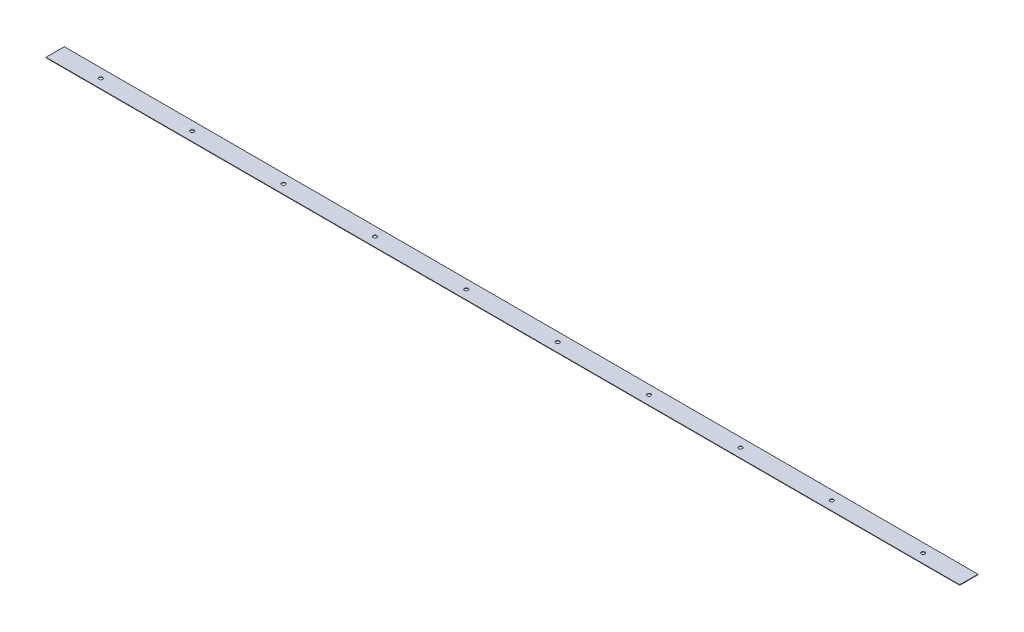
ISO-10303-21;
HEADER;
FILE_DESCRIPTION(('STEP AP214'),'2;1');
FILE_NAME('part.step','',(''),(''),'','','');
FILE_SCHEMA(('AUTOMOTIVE_DESIGN { 1 0 10303 214 1 1 1 1 }'));
ENDSEC;
DATA;
#1=APPLICATION_CONTEXT('core data for automotive mechanical design processes');
#2=APPLICATION_PROTOCOL_DEFINITION('international standard','automotive_design',2000,#1);
#3=PRODUCT_CONTEXT('',#1,'mechanical');
#4=PRODUCT('Part','Part','',(#3));
#5=PRODUCT_RELATED_PRODUCT_CATEGORY('part','',(#4));
#6=PRODUCT_DEFINITION_FORMATION('','',#4);
#7=PRODUCT_DEFINITION_CONTEXT('part definition',#1,'design');
#8=PRODUCT_DEFINITION('design','',#6,#7);
#9=PRODUCT_DEFINITION_SHAPE('','',#8);
#10=(LENGTH_UNIT() NAMED_UNIT(*) SI_UNIT(.MILLI.,.METRE.));
#11=(NAMED_UNIT(*) PLANE_ANGLE_UNIT() SI_UNIT($,.RADIAN.));
#12=(NAMED_UNIT(*) SI_UNIT($,.STERADIAN.) SOLID_ANGLE_UNIT());
#13=UNCERTAINTY_MEASURE_WITH_UNIT(LENGTH_MEASURE(1.E-05),#10,'distance_accuracy_value','');
#14=(GEOMETRIC_REPRESENTATION_CONTEXT(3) GLOBAL_UNCERTAINTY_ASSIGNED_CONTEXT((#13)) GLOBAL_UNIT_ASSIGNED_CONTEXT((#10,
#11,#12)) REPRESENTATION_CONTEXT('',''));
#15=CARTESIAN_POINT('',(0.,0.,0.));
#16=DIRECTION('',(0.,0.,1.));
#17=DIRECTION('',(1.,0.,0.));
#18=AXIS2_PLACEMENT_3D('',#15,#16,#17);
#19=CARTESIAN_POINT('',(500.,-0.5,10.));
#20=DIRECTION('',(1.,0.,0.));
#21=DIRECTION('',(0.,0.,-1.));
#22=AXIS2_PLACEMENT_3D('',#19,#20,#21);
#23=PLANE('',#22);
#24=DIRECTION('',(0.,0.,-1.));
#25=VECTOR('',#24,1.);
#26=CARTESIAN_POINT('',(500.,0.,10.));
#27=LINE('',#26,#25);
#28=CARTESIAN_POINT('',(500.,0.,10.));
#29=VERTEX_POINT('',#28);
#30=CARTESIAN_POINT('',(500.,0.,-10.));
#31=VERTEX_POINT('',#30);
#32=EDGE_CURVE('E103',#29,#31,#27,.T.);
#33=ORIENTED_EDGE('',*,*,#32,.F.);
#34=DIRECTION('',(0.,1.,0.));
#35=VECTOR('',#34,1.);
#36=CARTESIAN_POINT('',(500.,-0.5,10.));
#37=LINE('',#36,#35);
#38=CARTESIAN_POINT('',(500.,-0.5,10.));
#39=VERTEX_POINT('',#38);
#40=EDGE_CURVE('E11',#39,#29,#37,.T.);
#41=ORIENTED_EDGE('',*,*,#40,.F.);
#42=DIRECTION('',(0.,0.,-1.));
#43=VECTOR('',#42,1.);
#44=CARTESIAN_POINT('',(500.,-0.5,10.));
#45=LINE('',#44,#43);
#46=CARTESIAN_POINT('',(500.,-0.5,-10.));
#47=VERTEX_POINT('',#46);
#48=EDGE_CURVE('E96',#39,#47,#45,.T.);
#49=ORIENTED_EDGE('',*,*,#48,.T.);
#50=DIRECTION('',(0.,1.,0.));
#51=VECTOR('',#50,1.);
#52=CARTESIAN_POINT('',(500.,-0.5,-10.));
#53=LINE('',#52,#51);
#54=EDGE_CURVE('E41',#47,#31,#53,.T.);
#55=ORIENTED_EDGE('',*,*,#54,.T.);
#56=EDGE_LOOP('',(#33,#41,#49,#55));
#57=FACE_BOUND('',#56,.T.);
#58=ADVANCED_FACE('F38',(#57),#23,.T.);
#59=CARTESIAN_POINT('',(-500.,-0.5,10.));
#60=DIRECTION('',(0.,0.,1.));
#61=DIRECTION('',(1.,0.,0.));
#62=AXIS2_PLACEMENT_3D('',#59,#60,#61);
#63=PLANE('',#62);
#64=DIRECTION('',(1.,0.,0.));
#65=VECTOR('',#64,1.);
#66=CARTESIAN_POINT('',(-500.,0.,10.));
#67=LINE('',#66,#65);
#68=CARTESIAN_POINT('',(-500.,0.,10.));
#69=VERTEX_POINT('',#68);
#70=EDGE_CURVE('E98',#69,#29,#67,.T.);
#71=ORIENTED_EDGE('',*,*,#70,.F.);
#72=DIRECTION('',(0.,1.,0.));
#73=VECTOR('',#72,1.);
#74=CARTESIAN_POINT('',(-500.,-0.5,10.));
#75=LINE('',#74,#73);
#76=CARTESIAN_POINT('',(-500.,-0.5,10.));
#77=VERTEX_POINT('',#76);
#78=EDGE_CURVE('E47',#77,#69,#75,.T.);
#79=ORIENTED_EDGE('',*,*,#78,.F.);
#80=DIRECTION('',(1.,0.,0.));
#81=VECTOR('',#80,1.);
#82=CARTESIAN_POINT('',(-500.,-0.5,10.));
#83=LINE('',#82,#81);
#84=EDGE_CURVE('E93',#77,#39,#83,.T.);
#85=ORIENTED_EDGE('',*,*,#84,.T.);
#86=ORIENTED_EDGE('',*,*,#40,.T.);
#87=EDGE_LOOP('',(#71,#79,#85,#86));
#88=FACE_BOUND('',#87,.T.);
#89=ADVANCED_FACE('F114',(#88),#63,.T.);
#90=CARTESIAN_POINT('',(-500.,-0.5,10.));
#91=DIRECTION('',(-1.,0.,0.));
#92=DIRECTION('',(0.,0.,1.));
#93=AXIS2_PLACEMENT_3D('',#90,#91,#92);
#94=PLANE('',#93);
#95=DIRECTION('',(0.,0.,1.));
#96=VECTOR('',#95,1.);
#97=CARTESIAN_POINT('',(-500.,0.,10.));
#98=LINE('',#97,#96);
#99=CARTESIAN_POINT('',(-500.,0.,-10.));
#100=VERTEX_POINT('',#99);
#101=EDGE_CURVE('E88',#100,#69,#98,.T.);
#102=ORIENTED_EDGE('',*,*,#101,.F.);
#103=DIRECTION('',(0.,1.,0.));
#104=VECTOR('',#103,1.);
#105=CARTESIAN_POINT('',(-500.,-0.5,-10.));
#106=LINE('',#105,#104);
#107=CARTESIAN_POINT('',(-500.,-0.5,-10.));
#108=VERTEX_POINT('',#107);
#109=EDGE_CURVE('E83',#108,#100,#106,.T.);
#110=ORIENTED_EDGE('',*,*,#109,.F.);
#111=DIRECTION('',(0.,0.,1.));
#112=VECTOR('',#111,1.);
#113=CARTESIAN_POINT('',(-500.,-0.5,10.));
#114=LINE('',#113,#112);
#115=EDGE_CURVE('E86',#108,#77,#114,.T.);
#116=ORIENTED_EDGE('',*,*,#115,.T.);
#117=ORIENTED_EDGE('',*,*,#78,.T.);
#118=EDGE_LOOP('',(#102,#110,#116,#117));
#119=FACE_BOUND('',#118,.T.);
#120=ADVANCED_FACE('F85',(#119),#94,.T.);
#121=CARTESIAN_POINT('',(-500.,-0.5,-10.));
#122=DIRECTION('',(0.,0.,-1.));
#123=DIRECTION('',(-1.,0.,0.));
#124=AXIS2_PLACEMENT_3D('',#121,#122,#123);
#125=PLANE('',#124);
#126=DIRECTION('',(-1.,0.,0.));
#127=VECTOR('',#126,1.);
#128=CARTESIAN_POINT('',(-500.,0.,-10.));
#129=LINE('',#128,#127);
#130=EDGE_CURVE('E106',#31,#100,#129,.T.);
#131=ORIENTED_EDGE('',*,*,#130,.F.);
#132=ORIENTED_EDGE('',*,*,#54,.F.);
#133=DIRECTION('',(-1.,0.,0.));
#134=VECTOR('',#133,1.);
#135=CARTESIAN_POINT('',(-500.,-0.5,-10.));
#136=LINE('',#135,#134);
#137=EDGE_CURVE('E92',#47,#108,#136,.T.);
#138=ORIENTED_EDGE('',*,*,#137,.T.);
#139=ORIENTED_EDGE('',*,*,#109,.T.);
#140=EDGE_LOOP('',(#131,#132,#138,#139));
#141=FACE_BOUND('',#140,.T.);
#142=ADVANCED_FACE('F95',(#141),#125,.T.);
#143=CARTESIAN_POINT('',(0.,-0.5,0.));
#144=DIRECTION('',(0.,-1.,0.));
#145=DIRECTION('',(0.,0.,-1.));
#146=AXIS2_PLACEMENT_3D('',#143,#144,#145);
#147=PLANE('',#146);
#148=CARTESIAN_POINT('',(450.,-0.5,0.));
#149=DIRECTION('',(0.,-1.,0.));
#150=DIRECTION('',(0.,0.,-1.));
#151=AXIS2_PLACEMENT_3D('',#148,#149,#150);
#152=CIRCLE('',#151,2.);
#153=CARTESIAN_POINT('',(450.,-0.5,-2.));
#154=VERTEX_POINT('',#153);
#155=EDGE_CURVE('E107',#154,#154,#152,.T.);
#156=ORIENTED_EDGE('',*,*,#155,.F.);
#157=EDGE_LOOP('',(#156));
#158=FACE_BOUND('',#157,.T.);
#159=CARTESIAN_POINT('',(350.,-0.5,0.));
#160=DIRECTION('',(0.,-1.,0.));
#161=DIRECTION('',(0.,0.,-1.));
#162=AXIS2_PLACEMENT_3D('',#159,#160,#161);
#163=CIRCLE('',#162,2.);
#164=CARTESIAN_POINT('',(350.,-0.5,-2.));
#165=VERTEX_POINT('',#164);
#166=EDGE_CURVE('E236',#165,#165,#163,.T.);
#167=ORIENTED_EDGE('',*,*,#166,.F.);
#168=EDGE_LOOP('',(#167));
#169=FACE_BOUND('',#168,.T.);
#170=CARTESIAN_POINT('',(250.,-0.5,0.));
#171=DIRECTION('',(0.,-1.,0.));
#172=DIRECTION('',(0.,0.,-1.));
#173=AXIS2_PLACEMENT_3D('',#170,#171,#172);
#174=CIRCLE('',#173,2.);
#175=CARTESIAN_POINT('',(250.,-0.5,-2.));
#176=VERTEX_POINT('',#175);
#177=EDGE_CURVE('E233',#176,#176,#174,.T.);
#178=ORIENTED_EDGE('',*,*,#177,.F.);
#179=EDGE_LOOP('',(#178));
#180=FACE_BOUND('',#179,.T.);
#181=CARTESIAN_POINT('',(150.,-0.5,0.));
#182=DIRECTION('',(0.,-1.,0.));
#183=DIRECTION('',(0.,0.,-1.));
#184=AXIS2_PLACEMENT_3D('',#181,#182,#183);
#185=CIRCLE('',#184,2.);
#186=CARTESIAN_POINT('',(150.,-0.5,-2.));
#187=VERTEX_POINT('',#186);
#188=EDGE_CURVE('E230',#187,#187,#185,.T.);
#189=ORIENTED_EDGE('',*,*,#188,.F.);
#190=EDGE_LOOP('',(#189));
#191=FACE_BOUND('',#190,.T.);
#192=CARTESIAN_POINT('',(49.9999999999998,-0.5,0.));
#193=DIRECTION('',(0.,-1.,0.));
#194=DIRECTION('',(0.,0.,-1.));
#195=AXIS2_PLACEMENT_3D('',#192,#193,#194);
#196=CIRCLE('',#195,2.);
#197=CARTESIAN_POINT('',(49.9999999999998,-0.5,-2.));
#198=VERTEX_POINT('',#197);
#199=EDGE_CURVE('E227',#198,#198,#196,.T.);
#200=ORIENTED_EDGE('',*,*,#199,.F.);
#201=EDGE_LOOP('',(#200));
#202=FACE_BOUND('',#201,.T.);
#203=CARTESIAN_POINT('',(-50.0000000000002,-0.5,0.));
#204=DIRECTION('',(0.,-1.,0.));
#205=DIRECTION('',(0.,0.,-1.));
#206=AXIS2_PLACEMENT_3D('',#203,#204,#205);
#207=CIRCLE('',#206,2.);
#208=CARTESIAN_POINT('',(-50.0000000000002,-0.5,-2.));
#209=VERTEX_POINT('',#208);
#210=EDGE_CURVE('E224',#209,#209,#207,.T.);
#211=ORIENTED_EDGE('',*,*,#210,.F.);
#212=EDGE_LOOP('',(#211));
#213=FACE_BOUND('',#212,.T.);
#214=CARTESIAN_POINT('',(-150.,-0.5,0.));
#215=DIRECTION('',(0.,-1.,0.));
#216=DIRECTION('',(0.,0.,-1.));
#217=AXIS2_PLACEMENT_3D('',#214,#215,#216);
#218=CIRCLE('',#217,2.);
#219=CARTESIAN_POINT('',(-150.,-0.5,-2.));
#220=VERTEX_POINT('',#219);
#221=EDGE_CURVE('E221',#220,#220,#218,.T.);
#222=ORIENTED_EDGE('',*,*,#221,.F.);
#223=EDGE_LOOP('',(#222));
#224=FACE_BOUND('',#223,.T.);
#225=CARTESIAN_POINT('',(-250.,-0.5,0.));
#226=DIRECTION('',(0.,-1.,0.));
#227=DIRECTION('',(0.,0.,-1.));
#228=AXIS2_PLACEMENT_3D('',#225,#226,#227);
#229=CIRCLE('',#228,2.);
#230=CARTESIAN_POINT('',(-250.,-0.5,-2.));
#231=VERTEX_POINT('',#230);
#232=EDGE_CURVE('E218',#231,#231,#229,.T.);
#233=ORIENTED_EDGE('',*,*,#232,.F.);
#234=EDGE_LOOP('',(#233));
#235=FACE_BOUND('',#234,.T.);
#236=CARTESIAN_POINT('',(-450.,-0.5,0.));
#237=DIRECTION('',(0.,-1.,0.));
#238=DIRECTION('',(0.,0.,-1.));
#239=AXIS2_PLACEMENT_3D('',#236,#237,#238);
#240=CIRCLE('',#239,2.);
#241=CARTESIAN_POINT('',(-450.,-0.5,-2.));
#242=VERTEX_POINT('',#241);
#243=EDGE_CURVE('E180',#242,#242,#240,.T.);
#244=ORIENTED_EDGE('',*,*,#243,.F.);
#245=EDGE_LOOP('',(#244));
#246=FACE_BOUND('',#245,.T.);
#247=CARTESIAN_POINT('',(-350.,-0.5,0.));
#248=DIRECTION('',(0.,-1.,0.));
#249=DIRECTION('',(0.,0.,-1.));
#250=AXIS2_PLACEMENT_3D('',#247,#248,#249);
#251=CIRCLE('',#250,2.);
#252=CARTESIAN_POINT('',(-350.,-0.5,-2.));
#253=VERTEX_POINT('',#252);
#254=EDGE_CURVE('E189',#253,#253,#251,.T.);
#255=ORIENTED_EDGE('',*,*,#254,.F.);
#256=EDGE_LOOP('',(#255));
#257=FACE_BOUND('',#256,.T.);
#258=ORIENTED_EDGE('',*,*,#48,.F.);
#259=ORIENTED_EDGE('',*,*,#84,.F.);
#260=ORIENTED_EDGE('',*,*,#115,.F.);
#261=ORIENTED_EDGE('',*,*,#137,.F.);
#262=EDGE_LOOP('',(#258,#259,#260,#261));
#263=FACE_BOUND('',#262,.T.);
#264=ADVANCED_FACE('F91',(#158,#169,#180,#191,#202,#213,#224,#235,#246,#257,#263),#147,.T.);
#265=CARTESIAN_POINT('',(0.,0.,0.));
#266=DIRECTION('',(0.,-1.,0.));
#267=DIRECTION('',(0.,0.,-1.));
#268=AXIS2_PLACEMENT_3D('',#265,#266,#267);
#269=PLANE('',#268);
#270=CARTESIAN_POINT('',(450.,0.,0.));
#271=DIRECTION('',(0.,1.,0.));
#272=DIRECTION('',(0.,0.,1.));
#273=AXIS2_PLACEMENT_3D('',#270,#271,#272);
#274=CIRCLE('',#273,2.);
#275=CARTESIAN_POINT('',(450.,0.,2.));
#276=VERTEX_POINT('',#275);
#277=EDGE_CURVE('E212',#276,#276,#274,.T.);
#278=ORIENTED_EDGE('',*,*,#277,.F.);
#279=EDGE_LOOP('',(#278));
#280=FACE_BOUND('',#279,.T.);
#281=CARTESIAN_POINT('',(350.,0.,0.));
#282=DIRECTION('',(0.,1.,0.));
#283=DIRECTION('',(0.,0.,1.));
#284=AXIS2_PLACEMENT_3D('',#281,#282,#283);
#285=CIRCLE('',#284,2.);
#286=CARTESIAN_POINT('',(350.,0.,2.));
#287=VERTEX_POINT('',#286);
#288=EDGE_CURVE('E209',#287,#287,#285,.T.);
#289=ORIENTED_EDGE('',*,*,#288,.F.);
#290=EDGE_LOOP('',(#289));
#291=FACE_BOUND('',#290,.T.);
#292=CARTESIAN_POINT('',(250.,0.,0.));
#293=DIRECTION('',(0.,1.,0.));
#294=DIRECTION('',(0.,0.,1.));
#295=AXIS2_PLACEMENT_3D('',#292,#293,#294);
#296=CIRCLE('',#295,2.);
#297=CARTESIAN_POINT('',(250.,0.,2.));
#298=VERTEX_POINT('',#297);
#299=EDGE_CURVE('E206',#298,#298,#296,.T.);
#300=ORIENTED_EDGE('',*,*,#299,.F.);
#301=EDGE_LOOP('',(#300));
#302=FACE_BOUND('',#301,.T.);
#303=CARTESIAN_POINT('',(150.,0.,0.));
#304=DIRECTION('',(0.,1.,0.));
#305=DIRECTION('',(0.,0.,1.));
#306=AXIS2_PLACEMENT_3D('',#303,#304,#305);
#307=CIRCLE('',#306,2.);
#308=CARTESIAN_POINT('',(150.,0.,2.));
#309=VERTEX_POINT('',#308);
#310=EDGE_CURVE('E203',#309,#309,#307,.T.);
#311=ORIENTED_EDGE('',*,*,#310,.F.);
#312=EDGE_LOOP('',(#311));
#313=FACE_BOUND('',#312,.T.);
#314=CARTESIAN_POINT('',(49.9999999999998,0.,0.));
#315=DIRECTION('',(0.,1.,0.));
#316=DIRECTION('',(0.,0.,1.));
#317=AXIS2_PLACEMENT_3D('',#314,#315,#316);
#318=CIRCLE('',#317,2.);
#319=CARTESIAN_POINT('',(49.9999999999998,0.,2.));
#320=VERTEX_POINT('',#319);
#321=EDGE_CURVE('E200',#320,#320,#318,.T.);
#322=ORIENTED_EDGE('',*,*,#321,.F.);
#323=EDGE_LOOP('',(#322));
#324=FACE_BOUND('',#323,.T.);
#325=CARTESIAN_POINT('',(-50.0000000000002,0.,0.));
#326=DIRECTION('',(0.,1.,0.));
#327=DIRECTION('',(0.,0.,1.));
#328=AXIS2_PLACEMENT_3D('',#325,#326,#327);
#329=CIRCLE('',#328,2.);
#330=CARTESIAN_POINT('',(-50.0000000000002,0.,2.));
#331=VERTEX_POINT('',#330);
#332=EDGE_CURVE('E197',#331,#331,#329,.T.);
#333=ORIENTED_EDGE('',*,*,#332,.F.);
#334=EDGE_LOOP('',(#333));
#335=FACE_BOUND('',#334,.T.);
#336=CARTESIAN_POINT('',(-150.,0.,0.));
#337=DIRECTION('',(0.,1.,0.));
#338=DIRECTION('',(0.,0.,1.));
#339=AXIS2_PLACEMENT_3D('',#336,#337,#338);
#340=CIRCLE('',#339,2.);
#341=CARTESIAN_POINT('',(-150.,0.,2.));
#342=VERTEX_POINT('',#341);
#343=EDGE_CURVE('E192',#342,#342,#340,.T.);
#344=ORIENTED_EDGE('',*,*,#343,.F.);
#345=EDGE_LOOP('',(#344));
#346=FACE_BOUND('',#345,.T.);
#347=CARTESIAN_POINT('',(-250.,0.,0.));
#348=DIRECTION('',(0.,1.,0.));
#349=DIRECTION('',(0.,0.,1.));
#350=AXIS2_PLACEMENT_3D('',#347,#348,#349);
#351=CIRCLE('',#350,2.);
#352=CARTESIAN_POINT('',(-250.,0.,2.));
#353=VERTEX_POINT('',#352);
#354=EDGE_CURVE('E186',#353,#353,#351,.T.);
#355=ORIENTED_EDGE('',*,*,#354,.F.);
#356=EDGE_LOOP('',(#355));
#357=FACE_BOUND('',#356,.T.);
#358=CARTESIAN_POINT('',(-450.,0.,0.));
#359=DIRECTION('',(0.,1.,0.));
#360=DIRECTION('',(0.,0.,1.));
#361=AXIS2_PLACEMENT_3D('',#358,#359,#360);
#362=CIRCLE('',#361,2.);
#363=CARTESIAN_POINT('',(-450.,0.,2.));
#364=VERTEX_POINT('',#363);
#365=EDGE_CURVE('E183',#364,#364,#362,.T.);
#366=ORIENTED_EDGE('',*,*,#365,.F.);
#367=EDGE_LOOP('',(#366));
#368=FACE_BOUND('',#367,.T.);
#369=CARTESIAN_POINT('',(-350.,0.,0.));
#370=DIRECTION('',(0.,1.,0.));
#371=DIRECTION('',(0.,0.,1.));
#372=AXIS2_PLACEMENT_3D('',#369,#370,#371);
#373=CIRCLE('',#372,2.);
#374=CARTESIAN_POINT('',(-350.,0.,2.));
#375=VERTEX_POINT('',#374);
#376=EDGE_CURVE('E185',#375,#375,#373,.T.);
#377=ORIENTED_EDGE('',*,*,#376,.F.);
#378=EDGE_LOOP('',(#377));
#379=FACE_BOUND('',#378,.T.);
#380=ORIENTED_EDGE('',*,*,#32,.T.);
#381=ORIENTED_EDGE('',*,*,#130,.T.);
#382=ORIENTED_EDGE('',*,*,#101,.T.);
#383=ORIENTED_EDGE('',*,*,#70,.T.);
#384=EDGE_LOOP('',(#380,#381,#382,#383));
#385=FACE_BOUND('',#384,.T.);
#386=ADVANCED_FACE('F113',(#280,#291,#302,#313,#324,#335,#346,#357,#368,#379,#385),#269,.F.);
#387=CARTESIAN_POINT('',(-350.,-10.,0.));
#388=DIRECTION('',(0.,1.,0.));
#389=DIRECTION('',(0.,0.,1.));
#390=AXIS2_PLACEMENT_3D('',#387,#388,#389);
#391=CYLINDRICAL_SURFACE('',#390,2.);
#392=ORIENTED_EDGE('',*,*,#254,.T.);
#393=EDGE_LOOP('',(#392));
#394=FACE_BOUND('',#393,.T.);
#395=ORIENTED_EDGE('',*,*,#376,.T.);
#396=EDGE_LOOP('',(#395));
#397=FACE_BOUND('',#396,.T.);
#398=ADVANCED_FACE('F132',(#394,#397),#391,.F.);
#399=CARTESIAN_POINT('',(-450.,-10.,0.));
#400=DIRECTION('',(0.,1.,0.));
#401=DIRECTION('',(0.,0.,1.));
#402=AXIS2_PLACEMENT_3D('',#399,#400,#401);
#403=CYLINDRICAL_SURFACE('',#402,2.);
#404=ORIENTED_EDGE('',*,*,#243,.T.);
#405=EDGE_LOOP('',(#404));
#406=FACE_BOUND('',#405,.T.);
#407=ORIENTED_EDGE('',*,*,#365,.T.);
#408=EDGE_LOOP('',(#407));
#409=FACE_BOUND('',#408,.T.);
#410=ADVANCED_FACE('F139',(#406,#409),#403,.F.);
#411=CARTESIAN_POINT('',(-250.,-10.,0.));
#412=DIRECTION('',(0.,1.,0.));
#413=DIRECTION('',(0.,0.,1.));
#414=AXIS2_PLACEMENT_3D('',#411,#412,#413);
#415=CYLINDRICAL_SURFACE('',#414,2.);
#416=ORIENTED_EDGE('',*,*,#232,.T.);
#417=EDGE_LOOP('',(#416));
#418=FACE_BOUND('',#417,.T.);
#419=ORIENTED_EDGE('',*,*,#354,.T.);
#420=EDGE_LOOP('',(#419));
#421=FACE_BOUND('',#420,.T.);
#422=ADVANCED_FACE('F168',(#418,#421),#415,.F.);
#423=CARTESIAN_POINT('',(-150.,-10.,0.));
#424=DIRECTION('',(0.,1.,0.));
#425=DIRECTION('',(0.,0.,1.));
#426=AXIS2_PLACEMENT_3D('',#423,#424,#425);
#427=CYLINDRICAL_SURFACE('',#426,2.);
#428=ORIENTED_EDGE('',*,*,#221,.T.);
#429=EDGE_LOOP('',(#428));
#430=FACE_BOUND('',#429,.T.);
#431=ORIENTED_EDGE('',*,*,#343,.T.);
#432=EDGE_LOOP('',(#431));
#433=FACE_BOUND('',#432,.T.);
#434=ADVANCED_FACE('F164',(#430,#433),#427,.F.);
#435=CARTESIAN_POINT('',(-50.0000000000002,-10.,0.));
#436=DIRECTION('',(0.,1.,0.));
#437=DIRECTION('',(0.,0.,1.));
#438=AXIS2_PLACEMENT_3D('',#435,#436,#437);
#439=CYLINDRICAL_SURFACE('',#438,2.);
#440=ORIENTED_EDGE('',*,*,#210,.T.);
#441=EDGE_LOOP('',(#440));
#442=FACE_BOUND('',#441,.T.);
#443=ORIENTED_EDGE('',*,*,#332,.T.);
#444=EDGE_LOOP('',(#443));
#445=FACE_BOUND('',#444,.T.);
#446=ADVANCED_FACE('F160',(#442,#445),#439,.F.);
#447=CARTESIAN_POINT('',(49.9999999999998,-10.,0.));
#448=DIRECTION('',(0.,1.,0.));
#449=DIRECTION('',(0.,0.,1.));
#450=AXIS2_PLACEMENT_3D('',#447,#448,#449);
#451=CYLINDRICAL_SURFACE('',#450,2.);
#452=ORIENTED_EDGE('',*,*,#199,.T.);
#453=EDGE_LOOP('',(#452));
#454=FACE_BOUND('',#453,.T.);
#455=ORIENTED_EDGE('',*,*,#321,.T.);
#456=EDGE_LOOP('',(#455));
#457=FACE_BOUND('',#456,.T.);
#458=ADVANCED_FACE('F156',(#454,#457),#451,.F.);
#459=CARTESIAN_POINT('',(150.,-10.,0.));
#460=DIRECTION('',(0.,1.,0.));
#461=DIRECTION('',(0.,0.,1.));
#462=AXIS2_PLACEMENT_3D('',#459,#460,#461);
#463=CYLINDRICAL_SURFACE('',#462,2.);
#464=ORIENTED_EDGE('',*,*,#188,.T.);
#465=EDGE_LOOP('',(#464));
#466=FACE_BOUND('',#465,.T.);
#467=ORIENTED_EDGE('',*,*,#310,.T.);
#468=EDGE_LOOP('',(#467));
#469=FACE_BOUND('',#468,.T.);
#470=ADVANCED_FACE('F152',(#466,#469),#463,.F.);
#471=CARTESIAN_POINT('',(250.,-10.,0.));
#472=DIRECTION('',(0.,1.,0.));
#473=DIRECTION('',(0.,0.,1.));
#474=AXIS2_PLACEMENT_3D('',#471,#472,#473);
#475=CYLINDRICAL_SURFACE('',#474,2.);
#476=ORIENTED_EDGE('',*,*,#177,.T.);
#477=EDGE_LOOP('',(#476));
#478=FACE_BOUND('',#477,.T.);
#479=ORIENTED_EDGE('',*,*,#299,.T.);
#480=EDGE_LOOP('',(#479));
#481=FACE_BOUND('',#480,.T.);
#482=ADVANCED_FACE('F148',(#478,#481),#475,.F.);
#483=CARTESIAN_POINT('',(350.,-10.,0.));
#484=DIRECTION('',(0.,1.,0.));
#485=DIRECTION('',(0.,0.,1.));
#486=AXIS2_PLACEMENT_3D('',#483,#484,#485);
#487=CYLINDRICAL_SURFACE('',#486,2.);
#488=ORIENTED_EDGE('',*,*,#166,.T.);
#489=EDGE_LOOP('',(#488));
#490=FACE_BOUND('',#489,.T.);
#491=ORIENTED_EDGE('',*,*,#288,.T.);
#492=EDGE_LOOP('',(#491));
#493=FACE_BOUND('',#492,.T.);
#494=ADVANCED_FACE('F144',(#490,#493),#487,.F.);
#495=CARTESIAN_POINT('',(450.,-10.,0.));
#496=DIRECTION('',(0.,1.,0.));
#497=DIRECTION('',(0.,0.,1.));
#498=AXIS2_PLACEMENT_3D('',#495,#496,#497);
#499=CYLINDRICAL_SURFACE('',#498,2.);
#500=ORIENTED_EDGE('',*,*,#155,.T.);
#501=EDGE_LOOP('',(#500));
#502=FACE_BOUND('',#501,.T.);
#503=ORIENTED_EDGE('',*,*,#277,.T.);
#504=EDGE_LOOP('',(#503));
#505=FACE_BOUND('',#504,.T.);
#506=ADVANCED_FACE('F141',(#502,#505),#499,.F.);
#507=CLOSED_SHELL('',(#58,#89,#120,#142,#264,#386,#398,#410,#422,#434,#446,#458,#470,#482,#494,#506));
#508=MANIFOLD_SOLID_BREP('B2',#507);
#509=ADVANCED_BREP_SHAPE_REPRESENTATION('',(#18,#508),#14);
#510=SHAPE_DEFINITION_REPRESENTATION(#9,#509);
ENDSEC;
END-ISO-10303-21;
